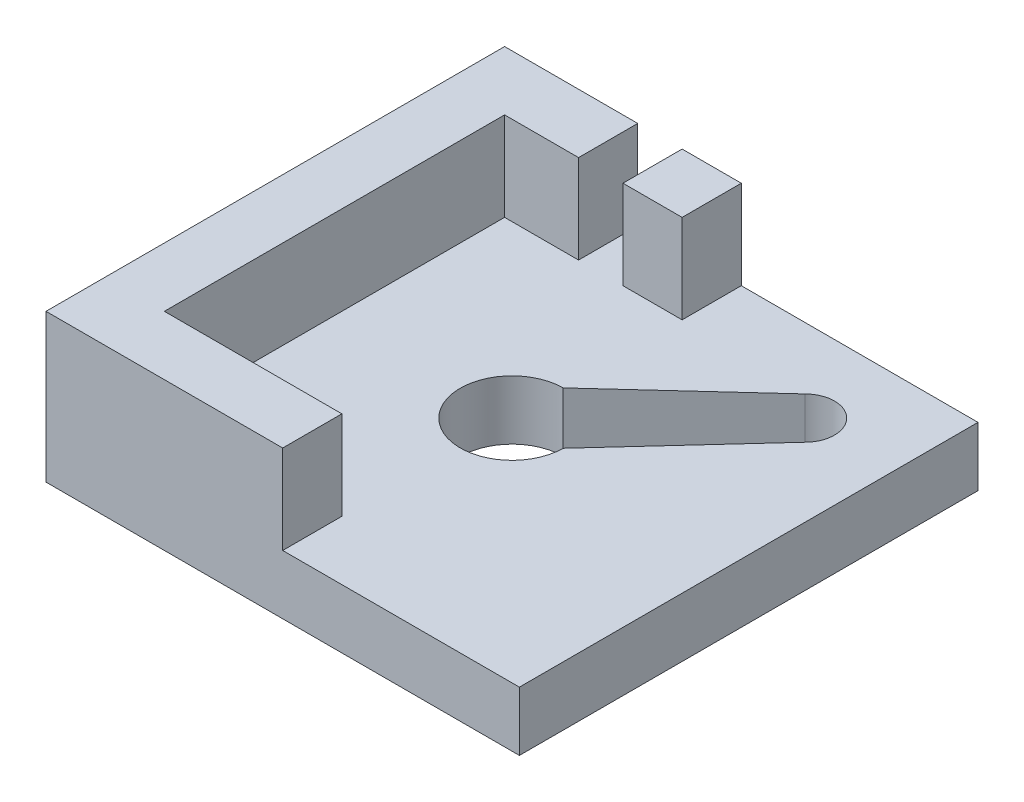
ISO-10303-21;
HEADER;
FILE_DESCRIPTION(('STEP AP214'),'2;1');
FILE_NAME('part.step','',(''),(''),'','','');
FILE_SCHEMA(('AUTOMOTIVE_DESIGN { 1 0 10303 214 1 1 1 1 }'));
ENDSEC;
DATA;
#1=APPLICATION_CONTEXT('core data for automotive mechanical design processes');
#2=APPLICATION_PROTOCOL_DEFINITION('international standard','automotive_design',2000,#1);
#3=PRODUCT_CONTEXT('',#1,'mechanical');
#4=PRODUCT('Part','Part','',(#3));
#5=PRODUCT_RELATED_PRODUCT_CATEGORY('part','',(#4));
#6=PRODUCT_DEFINITION_FORMATION('','',#4);
#7=PRODUCT_DEFINITION_CONTEXT('part definition',#1,'design');
#8=PRODUCT_DEFINITION('design','',#6,#7);
#9=PRODUCT_DEFINITION_SHAPE('','',#8);
#10=(LENGTH_UNIT() NAMED_UNIT(*) SI_UNIT(.MILLI.,.METRE.));
#11=(NAMED_UNIT(*) PLANE_ANGLE_UNIT() SI_UNIT($,.RADIAN.));
#12=(NAMED_UNIT(*) SI_UNIT($,.STERADIAN.) SOLID_ANGLE_UNIT());
#13=UNCERTAINTY_MEASURE_WITH_UNIT(LENGTH_MEASURE(1.E-05),#10,'distance_accuracy_value','');
#14=(GEOMETRIC_REPRESENTATION_CONTEXT(3) GLOBAL_UNCERTAINTY_ASSIGNED_CONTEXT((#13)) GLOBAL_UNIT_ASSIGNED_CONTEXT((#10,
#11,#12)) REPRESENTATION_CONTEXT('',''));
#15=CARTESIAN_POINT('',(0.,0.,0.));
#16=DIRECTION('',(0.,0.,1.));
#17=DIRECTION('',(1.,0.,0.));
#18=AXIS2_PLACEMENT_3D('',#15,#16,#17);
#19=CARTESIAN_POINT('',(0.,4.,0.));
#20=DIRECTION('',(0.,-1.,0.));
#21=DIRECTION('',(0.,0.,-1.));
#22=AXIS2_PLACEMENT_3D('',#19,#20,#21);
#23=PLANE('',#22);
#24=DIRECTION('',(0.,0.,-1.));
#25=VECTOR('',#24,1.);
#26=CARTESIAN_POINT('',(0.,4.,-15.5));
#27=LINE('',#26,#25);
#28=CARTESIAN_POINT('',(0.,4.,-11.5));
#29=VERTEX_POINT('',#28);
#30=CARTESIAN_POINT('',(0.,4.,-15.5));
#31=VERTEX_POINT('',#30);
#32=EDGE_CURVE('E252',#29,#31,#27,.T.);
#33=ORIENTED_EDGE('',*,*,#32,.F.);
#34=DIRECTION('',(1.,0.,0.));
#35=VECTOR('',#34,1.);
#36=CARTESIAN_POINT('',(0.,4.,-11.5));
#37=LINE('',#36,#35);
#38=CARTESIAN_POINT('',(-4.,4.,-11.5));
#39=VERTEX_POINT('',#38);
#40=EDGE_CURVE('E248',#39,#29,#37,.T.);
#41=ORIENTED_EDGE('',*,*,#40,.F.);
#42=DIRECTION('',(0.,0.,-1.));
#43=VECTOR('',#42,1.);
#44=CARTESIAN_POINT('',(-4.,4.,-15.5));
#45=LINE('',#44,#43);
#46=CARTESIAN_POINT('',(-4.,4.,-15.5));
#47=VERTEX_POINT('',#46);
#48=EDGE_CURVE('E198',#39,#47,#45,.T.);
#49=ORIENTED_EDGE('',*,*,#48,.T.);
#50=DIRECTION('',(-1.,0.,0.));
#51=VECTOR('',#50,1.);
#52=CARTESIAN_POINT('',(-7.,4.,-15.5));
#53=LINE('',#52,#51);
#54=CARTESIAN_POINT('',(-7.,4.,-15.5));
#55=VERTEX_POINT('',#54);
#56=EDGE_CURVE('E202',#47,#55,#53,.T.);
#57=ORIENTED_EDGE('',*,*,#56,.T.);
#58=DIRECTION('',(0.,0.,1.));
#59=VECTOR('',#58,1.);
#60=CARTESIAN_POINT('',(-7.,4.,-15.5));
#61=LINE('',#60,#59);
#62=CARTESIAN_POINT('',(-7.,4.,-11.5));
#63=VERTEX_POINT('',#62);
#64=EDGE_CURVE('E195',#55,#63,#61,.T.);
#65=ORIENTED_EDGE('',*,*,#64,.T.);
#66=CARTESIAN_POINT('',(-12.,4.,-11.5));
#67=VERTEX_POINT('',#66);
#68=EDGE_CURVE('E249',#67,#63,#37,.T.);
#69=ORIENTED_EDGE('',*,*,#68,.F.);
#70=DIRECTION('',(0.,0.,-1.));
#71=VECTOR('',#70,1.);
#72=CARTESIAN_POINT('',(-12.,4.,-11.5));
#73=LINE('',#72,#71);
#74=CARTESIAN_POINT('',(-12.,4.,11.5));
#75=VERTEX_POINT('',#74);
#76=EDGE_CURVE('E245',#75,#67,#73,.T.);
#77=ORIENTED_EDGE('',*,*,#76,.F.);
#78=DIRECTION('',(-1.,0.,0.));
#79=VECTOR('',#78,1.);
#80=CARTESIAN_POINT('',(-12.,4.,11.5));
#81=LINE('',#80,#79);
#82=CARTESIAN_POINT('',(0.,4.,11.5));
#83=VERTEX_POINT('',#82);
#84=EDGE_CURVE('E242',#83,#75,#81,.T.);
#85=ORIENTED_EDGE('',*,*,#84,.F.);
#86=DIRECTION('',(0.,0.,-1.));
#87=VECTOR('',#86,1.);
#88=CARTESIAN_POINT('',(0.,4.,15.5));
#89=LINE('',#88,#87);
#90=CARTESIAN_POINT('',(0.,4.,15.5));
#91=VERTEX_POINT('',#90);
#92=EDGE_CURVE('E210',#91,#83,#89,.T.);
#93=ORIENTED_EDGE('',*,*,#92,.F.);
#94=DIRECTION('',(1.,0.,0.));
#95=VECTOR('',#94,1.);
#96=CARTESIAN_POINT('',(-16.,4.,15.5));
#97=LINE('',#96,#95);
#98=CARTESIAN_POINT('',(16.,4.,15.5));
#99=VERTEX_POINT('',#98);
#100=EDGE_CURVE('E279',#91,#99,#97,.T.);
#101=ORIENTED_EDGE('',*,*,#100,.T.);
#102=DIRECTION('',(0.,0.,-1.));
#103=VECTOR('',#102,1.);
#104=CARTESIAN_POINT('',(16.,4.,15.5));
#105=LINE('',#104,#103);
#106=CARTESIAN_POINT('',(16.,4.,-15.5));
#107=VERTEX_POINT('',#106);
#108=EDGE_CURVE('E273',#99,#107,#105,.T.);
#109=ORIENTED_EDGE('',*,*,#108,.T.);
#110=DIRECTION('',(-1.,0.,0.));
#111=VECTOR('',#110,1.);
#112=CARTESIAN_POINT('',(-16.,4.,-15.5));
#113=LINE('',#112,#111);
#114=EDGE_CURVE('E276',#107,#31,#113,.T.);
#115=ORIENTED_EDGE('',*,*,#114,.T.);
#116=EDGE_LOOP('',(#33,#41,#49,#57,#65,#69,#77,#85,#93,#101,#109,#115));
#117=FACE_BOUND('',#116,.T.);
#118=CARTESIAN_POINT('',(9.89949493661086,4.,-9.89949493661249));
#119=DIRECTION('',(0.,1.,0.));
#120=DIRECTION('',(0.,0.,1.));
#121=AXIS2_PLACEMENT_3D('',#118,#119,#120);
#122=CIRCLE('',#121,1.99999999999998);
#123=CARTESIAN_POINT('',(8.48528137423761,4.,-11.3137084989855));
#124=VERTEX_POINT('',#123);
#125=CARTESIAN_POINT('',(11.3137084989841,4.,-8.48528137423954));
#126=VERTEX_POINT('',#125);
#127=EDGE_CURVE('E49',#124,#126,#122,.F.);
#128=ORIENTED_EDGE('',*,*,#127,.T.);
#129=DIRECTION('',(0.675864508150476,0.,-0.737025892776173));
#130=VECTOR('',#129,1.);
#131=CARTESIAN_POINT('',(1.91891736013424,4.,1.75967784917755));
#132=LINE('',#131,#130);
#133=CARTESIAN_POINT('',(3.49981776053525,4.,0.0357161453971998));
#134=VERTEX_POINT('',#133);
#135=EDGE_CURVE('E176',#134,#126,#132,.T.);
#136=ORIENTED_EDGE('',*,*,#135,.F.);
#137=CARTESIAN_POINT('',(0.,4.,0.));
#138=DIRECTION('',(0.,1.,0.));
#139=DIRECTION('',(0.,0.,1.));
#140=AXIS2_PLACEMENT_3D('',#137,#138,#139);
#141=CIRCLE('',#140,3.5);
#142=CARTESIAN_POINT('',(-0.0357161453977829,4.,-3.49981776053524));
#143=VERTEX_POINT('',#142);
#144=EDGE_CURVE('E179',#143,#134,#141,.T.);
#145=ORIENTED_EDGE('',*,*,#144,.F.);
#146=DIRECTION('',(0.73702589277606,0.,-0.675864508150599));
#147=VECTOR('',#146,1.);
#148=CARTESIAN_POINT('',(-1.75967784917787,4.,-1.91891736013395));
#149=LINE('',#148,#147);
#150=EDGE_CURVE('E185',#143,#124,#149,.T.);
#151=ORIENTED_EDGE('',*,*,#150,.T.);
#152=EDGE_LOOP('',(#128,#136,#145,#151));
#153=FACE_BOUND('',#152,.T.);
#154=ADVANCED_FACE('F34',(#117,#153),#23,.F.);
#155=CARTESIAN_POINT('',(0.,0.,0.));
#156=DIRECTION('',(0.,-1.,0.));
#157=DIRECTION('',(0.,0.,-1.));
#158=AXIS2_PLACEMENT_3D('',#155,#156,#157);
#159=PLANE('',#158);
#160=DIRECTION('',(0.,0.,-1.));
#161=VECTOR('',#160,1.);
#162=CARTESIAN_POINT('',(16.,0.,15.5));
#163=LINE('',#162,#161);
#164=CARTESIAN_POINT('',(16.,0.,15.5));
#165=VERTEX_POINT('',#164);
#166=CARTESIAN_POINT('',(16.,0.,-15.5));
#167=VERTEX_POINT('',#166);
#168=EDGE_CURVE('E272',#165,#167,#163,.T.);
#169=ORIENTED_EDGE('',*,*,#168,.F.);
#170=DIRECTION('',(1.,0.,0.));
#171=VECTOR('',#170,1.);
#172=CARTESIAN_POINT('',(-16.,0.,15.5));
#173=LINE('',#172,#171);
#174=CARTESIAN_POINT('',(-16.,0.,15.5));
#175=VERTEX_POINT('',#174);
#176=EDGE_CURVE('E277',#175,#165,#173,.T.);
#177=ORIENTED_EDGE('',*,*,#176,.F.);
#178=DIRECTION('',(0.,0.,1.));
#179=VECTOR('',#178,1.);
#180=CARTESIAN_POINT('',(-16.,0.,15.5));
#181=LINE('',#180,#179);
#182=CARTESIAN_POINT('',(-16.,0.,-15.5));
#183=VERTEX_POINT('',#182);
#184=EDGE_CURVE('E286',#183,#175,#181,.T.);
#185=ORIENTED_EDGE('',*,*,#184,.F.);
#186=DIRECTION('',(-1.,0.,0.));
#187=VECTOR('',#186,1.);
#188=CARTESIAN_POINT('',(-16.,0.,-15.5));
#189=LINE('',#188,#187);
#190=EDGE_CURVE('E284',#167,#183,#189,.T.);
#191=ORIENTED_EDGE('',*,*,#190,.F.);
#192=EDGE_LOOP('',(#169,#177,#185,#191));
#193=FACE_BOUND('',#192,.T.);
#194=DIRECTION('',(0.675864508150476,0.,-0.737025892776173));
#195=VECTOR('',#194,1.);
#196=CARTESIAN_POINT('',(1.91891736013424,0.,1.75967784917755));
#197=LINE('',#196,#195);
#198=CARTESIAN_POINT('',(3.49981776053525,0.,0.0357161453971998));
#199=VERTEX_POINT('',#198);
#200=CARTESIAN_POINT('',(11.3137084989841,0.,-8.48528137423954));
#201=VERTEX_POINT('',#200);
#202=EDGE_CURVE('E171',#199,#201,#197,.T.);
#203=ORIENTED_EDGE('',*,*,#202,.T.);
#204=CARTESIAN_POINT('',(9.89949493661086,0.,-9.89949493661249));
#205=DIRECTION('',(0.,1.,0.));
#206=DIRECTION('',(0.,0.,1.));
#207=AXIS2_PLACEMENT_3D('',#204,#205,#206);
#208=CIRCLE('',#207,1.99999999999998);
#209=CARTESIAN_POINT('',(8.48528137423761,0.,-11.3137084989855));
#210=VERTEX_POINT('',#209);
#211=EDGE_CURVE('E167',#210,#201,#208,.F.);
#212=ORIENTED_EDGE('',*,*,#211,.F.);
#213=DIRECTION('',(0.73702589277606,0.,-0.675864508150599));
#214=VECTOR('',#213,1.);
#215=CARTESIAN_POINT('',(-1.75967784917787,0.,-1.91891736013395));
#216=LINE('',#215,#214);
#217=CARTESIAN_POINT('',(-0.0357161453977831,0.,-3.49981776053524));
#218=VERTEX_POINT('',#217);
#219=EDGE_CURVE('E159',#218,#210,#216,.T.);
#220=ORIENTED_EDGE('',*,*,#219,.F.);
#221=CARTESIAN_POINT('',(0.,0.,0.));
#222=DIRECTION('',(0.,1.,0.));
#223=DIRECTION('',(0.,0.,1.));
#224=AXIS2_PLACEMENT_3D('',#221,#222,#223);
#225=CIRCLE('',#224,3.5);
#226=EDGE_CURVE('E57',#218,#199,#225,.T.);
#227=ORIENTED_EDGE('',*,*,#226,.T.);
#228=EDGE_LOOP('',(#203,#212,#220,#227));
#229=FACE_BOUND('',#228,.T.);
#230=ADVANCED_FACE('F174',(#193,#229),#159,.T.);
#231=CARTESIAN_POINT('',(0.,10.,-11.5));
#232=DIRECTION('',(0.,0.,-1.));
#233=DIRECTION('',(-1.,0.,0.));
#234=AXIS2_PLACEMENT_3D('',#231,#232,#233);
#235=PLANE('',#234);
#236=ORIENTED_EDGE('',*,*,#68,.T.);
#237=DIRECTION('',(0.,1.,0.));
#238=VECTOR('',#237,1.);
#239=CARTESIAN_POINT('',(-7.,4.,-11.5));
#240=LINE('',#239,#238);
#241=CARTESIAN_POINT('',(-7.,10.,-11.5));
#242=VERTEX_POINT('',#241);
#243=EDGE_CURVE('E205',#63,#242,#240,.T.);
#244=ORIENTED_EDGE('',*,*,#243,.T.);
#245=DIRECTION('',(1.,0.,0.));
#246=VECTOR('',#245,1.);
#247=CARTESIAN_POINT('',(0.,10.,-11.5));
#248=LINE('',#247,#246);
#249=CARTESIAN_POINT('',(-12.,10.,-11.5));
#250=VERTEX_POINT('',#249);
#251=EDGE_CURVE('E234',#250,#242,#248,.T.);
#252=ORIENTED_EDGE('',*,*,#251,.F.);
#253=DIRECTION('',(0.,-1.,0.));
#254=VECTOR('',#253,1.);
#255=CARTESIAN_POINT('',(-12.,10.,-11.5));
#256=LINE('',#255,#254);
#257=EDGE_CURVE('E260',#250,#67,#256,.T.);
#258=ORIENTED_EDGE('',*,*,#257,.T.);
#259=EDGE_LOOP('',(#236,#244,#252,#258));
#260=FACE_BOUND('',#259,.T.);
#261=ADVANCED_FACE('F355',(#260),#235,.F.);
#262=CARTESIAN_POINT('',(0.,10.,0.));
#263=DIRECTION('',(0.,-1.,0.));
#264=DIRECTION('',(0.,0.,-1.));
#265=AXIS2_PLACEMENT_3D('',#262,#263,#264);
#266=PLANE('',#265);
#267=ORIENTED_EDGE('',*,*,#251,.T.);
#268=DIRECTION('',(0.,0.,1.));
#269=VECTOR('',#268,1.);
#270=CARTESIAN_POINT('',(-7.,10.,-15.5));
#271=LINE('',#270,#269);
#272=CARTESIAN_POINT('',(-7.,10.,-15.5));
#273=VERTEX_POINT('',#272);
#274=EDGE_CURVE('E191',#273,#242,#271,.T.);
#275=ORIENTED_EDGE('',*,*,#274,.F.);
#276=DIRECTION('',(-1.,0.,0.));
#277=VECTOR('',#276,1.);
#278=CARTESIAN_POINT('',(-16.,10.,-15.5));
#279=LINE('',#278,#277);
#280=CARTESIAN_POINT('',(-16.,10.,-15.5));
#281=VERTEX_POINT('',#280);
#282=EDGE_CURVE('E222',#273,#281,#279,.T.);
#283=ORIENTED_EDGE('',*,*,#282,.T.);
#284=DIRECTION('',(0.,0.,1.));
#285=VECTOR('',#284,1.);
#286=CARTESIAN_POINT('',(-16.,10.,-15.5));
#287=LINE('',#286,#285);
#288=CARTESIAN_POINT('',(-16.,10.,15.5));
#289=VERTEX_POINT('',#288);
#290=EDGE_CURVE('E221',#281,#289,#287,.T.);
#291=ORIENTED_EDGE('',*,*,#290,.T.);
#292=DIRECTION('',(1.,0.,0.));
#293=VECTOR('',#292,1.);
#294=CARTESIAN_POINT('',(-16.,10.,15.5));
#295=LINE('',#294,#293);
#296=CARTESIAN_POINT('',(0.,10.,15.5));
#297=VERTEX_POINT('',#296);
#298=EDGE_CURVE('E225',#289,#297,#295,.T.);
#299=ORIENTED_EDGE('',*,*,#298,.T.);
#300=DIRECTION('',(0.,0.,-1.));
#301=VECTOR('',#300,1.);
#302=CARTESIAN_POINT('',(0.,10.,15.5));
#303=LINE('',#302,#301);
#304=CARTESIAN_POINT('',(0.,10.,11.5));
#305=VERTEX_POINT('',#304);
#306=EDGE_CURVE('E227',#297,#305,#303,.T.);
#307=ORIENTED_EDGE('',*,*,#306,.T.);
#308=DIRECTION('',(-1.,0.,0.));
#309=VECTOR('',#308,1.);
#310=CARTESIAN_POINT('',(-12.,10.,11.5));
#311=LINE('',#310,#309);
#312=CARTESIAN_POINT('',(-12.,10.,11.5));
#313=VERTEX_POINT('',#312);
#314=EDGE_CURVE('E229',#305,#313,#311,.T.);
#315=ORIENTED_EDGE('',*,*,#314,.T.);
#316=DIRECTION('',(0.,0.,-1.));
#317=VECTOR('',#316,1.);
#318=CARTESIAN_POINT('',(-12.,10.,-11.5));
#319=LINE('',#318,#317);
#320=EDGE_CURVE('E231',#313,#250,#319,.T.);
#321=ORIENTED_EDGE('',*,*,#320,.T.);
#322=EDGE_LOOP('',(#267,#275,#283,#291,#299,#307,#315,#321));
#323=FACE_BOUND('',#322,.T.);
#324=ADVANCED_FACE('F322',(#323),#266,.F.);
#325=CARTESIAN_POINT('',(16.,4.,15.5));
#326=DIRECTION('',(-1.,0.,0.));
#327=DIRECTION('',(0.,0.,1.));
#328=AXIS2_PLACEMENT_3D('',#325,#326,#327);
#329=PLANE('',#328);
#330=ORIENTED_EDGE('',*,*,#168,.T.);
#331=DIRECTION('',(0.,-1.,0.));
#332=VECTOR('',#331,1.);
#333=CARTESIAN_POINT('',(16.,4.,-15.5));
#334=LINE('',#333,#332);
#335=EDGE_CURVE('E11',#107,#167,#334,.T.);
#336=ORIENTED_EDGE('',*,*,#335,.F.);
#337=ORIENTED_EDGE('',*,*,#108,.F.);
#338=DIRECTION('',(0.,-1.,0.));
#339=VECTOR('',#338,1.);
#340=CARTESIAN_POINT('',(16.,4.,15.5));
#341=LINE('',#340,#339);
#342=EDGE_CURVE('E281',#99,#165,#341,.T.);
#343=ORIENTED_EDGE('',*,*,#342,.T.);
#344=EDGE_LOOP('',(#330,#336,#337,#343));
#345=FACE_BOUND('',#344,.T.);
#346=ADVANCED_FACE('F36',(#345),#329,.F.);
#347=CARTESIAN_POINT('',(-16.,4.,-15.5));
#348=DIRECTION('',(0.,0.,1.));
#349=DIRECTION('',(1.,0.,0.));
#350=AXIS2_PLACEMENT_3D('',#347,#348,#349);
#351=PLANE('',#350);
#352=ORIENTED_EDGE('',*,*,#282,.F.);
#353=DIRECTION('',(0.,1.,0.));
#354=VECTOR('',#353,1.);
#355=CARTESIAN_POINT('',(-7.,4.,-15.5));
#356=LINE('',#355,#354);
#357=EDGE_CURVE('E208',#55,#273,#356,.T.);
#358=ORIENTED_EDGE('',*,*,#357,.F.);
#359=ORIENTED_EDGE('',*,*,#56,.F.);
#360=DIRECTION('',(0.,1.,0.));
#361=VECTOR('',#360,1.);
#362=CARTESIAN_POINT('',(-4.,4.,-15.5));
#363=LINE('',#362,#361);
#364=CARTESIAN_POINT('',(-4.,10.,-15.5));
#365=VERTEX_POINT('',#364);
#366=EDGE_CURVE('E211',#47,#365,#363,.T.);
#367=ORIENTED_EDGE('',*,*,#366,.T.);
#368=CARTESIAN_POINT('',(0.,10.,-15.5));
#369=VERTEX_POINT('',#368);
#370=EDGE_CURVE('E218',#369,#365,#279,.T.);
#371=ORIENTED_EDGE('',*,*,#370,.F.);
#372=DIRECTION('',(0.,-1.,0.));
#373=VECTOR('',#372,1.);
#374=CARTESIAN_POINT('',(0.,10.,-15.5));
#375=LINE('',#374,#373);
#376=EDGE_CURVE('E239',#369,#31,#375,.T.);
#377=ORIENTED_EDGE('',*,*,#376,.T.);
#378=ORIENTED_EDGE('',*,*,#114,.F.);
#379=ORIENTED_EDGE('',*,*,#335,.T.);
#380=ORIENTED_EDGE('',*,*,#190,.T.);
#381=DIRECTION('',(0.,-1.,0.));
#382=VECTOR('',#381,1.);
#383=CARTESIAN_POINT('',(-16.,4.,-15.5));
#384=LINE('',#383,#382);
#385=EDGE_CURVE('E42',#281,#183,#384,.T.);
#386=ORIENTED_EDGE('',*,*,#385,.F.);
#387=EDGE_LOOP('',(#352,#358,#359,#367,#371,#377,#378,#379,#380,#386));
#388=FACE_BOUND('',#387,.T.);
#389=ADVANCED_FACE('F326',(#388),#351,.F.);
#390=CARTESIAN_POINT('',(-16.,4.,15.5));
#391=DIRECTION('',(1.,0.,0.));
#392=DIRECTION('',(0.,0.,-1.));
#393=AXIS2_PLACEMENT_3D('',#390,#391,#392);
#394=PLANE('',#393);
#395=ORIENTED_EDGE('',*,*,#184,.T.);
#396=DIRECTION('',(0.,-1.,0.));
#397=VECTOR('',#396,1.);
#398=CARTESIAN_POINT('',(-16.,4.,15.5));
#399=LINE('',#398,#397);
#400=EDGE_CURVE('E291',#289,#175,#399,.T.);
#401=ORIENTED_EDGE('',*,*,#400,.F.);
#402=ORIENTED_EDGE('',*,*,#290,.F.);
#403=ORIENTED_EDGE('',*,*,#385,.T.);
#404=EDGE_LOOP('',(#395,#401,#402,#403));
#405=FACE_BOUND('',#404,.T.);
#406=ADVANCED_FACE('F298',(#405),#394,.F.);
#407=CARTESIAN_POINT('',(-16.,4.,15.5));
#408=DIRECTION('',(0.,0.,-1.));
#409=DIRECTION('',(-1.,0.,0.));
#410=AXIS2_PLACEMENT_3D('',#407,#408,#409);
#411=PLANE('',#410);
#412=ORIENTED_EDGE('',*,*,#176,.T.);
#413=ORIENTED_EDGE('',*,*,#342,.F.);
#414=ORIENTED_EDGE('',*,*,#100,.F.);
#415=DIRECTION('',(0.,-1.,0.));
#416=VECTOR('',#415,1.);
#417=CARTESIAN_POINT('',(0.,10.,15.5));
#418=LINE('',#417,#416);
#419=EDGE_CURVE('E269',#297,#91,#418,.T.);
#420=ORIENTED_EDGE('',*,*,#419,.F.);
#421=ORIENTED_EDGE('',*,*,#298,.F.);
#422=ORIENTED_EDGE('',*,*,#400,.T.);
#423=EDGE_LOOP('',(#412,#413,#414,#420,#421,#422));
#424=FACE_BOUND('',#423,.T.);
#425=ADVANCED_FACE('F306',(#424),#411,.F.);
#426=CARTESIAN_POINT('',(0.,10.,15.5));
#427=DIRECTION('',(-1.,0.,0.));
#428=DIRECTION('',(0.,0.,1.));
#429=AXIS2_PLACEMENT_3D('',#426,#427,#428);
#430=PLANE('',#429);
#431=ORIENTED_EDGE('',*,*,#92,.T.);
#432=DIRECTION('',(0.,-1.,0.));
#433=VECTOR('',#432,1.);
#434=CARTESIAN_POINT('',(0.,10.,11.5));
#435=LINE('',#434,#433);
#436=EDGE_CURVE('E266',#305,#83,#435,.T.);
#437=ORIENTED_EDGE('',*,*,#436,.F.);
#438=ORIENTED_EDGE('',*,*,#306,.F.);
#439=ORIENTED_EDGE('',*,*,#419,.T.);
#440=EDGE_LOOP('',(#431,#437,#438,#439));
#441=FACE_BOUND('',#440,.T.);
#442=ADVANCED_FACE('F318',(#441),#430,.F.);
#443=CARTESIAN_POINT('',(-12.,10.,11.5));
#444=DIRECTION('',(0.,0.,1.));
#445=DIRECTION('',(1.,0.,0.));
#446=AXIS2_PLACEMENT_3D('',#443,#444,#445);
#447=PLANE('',#446);
#448=ORIENTED_EDGE('',*,*,#84,.T.);
#449=DIRECTION('',(0.,-1.,0.));
#450=VECTOR('',#449,1.);
#451=CARTESIAN_POINT('',(-12.,10.,11.5));
#452=LINE('',#451,#450);
#453=EDGE_CURVE('E263',#313,#75,#452,.T.);
#454=ORIENTED_EDGE('',*,*,#453,.F.);
#455=ORIENTED_EDGE('',*,*,#314,.F.);
#456=ORIENTED_EDGE('',*,*,#436,.T.);
#457=EDGE_LOOP('',(#448,#454,#455,#456));
#458=FACE_BOUND('',#457,.T.);
#459=ADVANCED_FACE('F478',(#458),#447,.F.);
#460=CARTESIAN_POINT('',(-12.,10.,-11.5));
#461=DIRECTION('',(-1.,0.,0.));
#462=DIRECTION('',(0.,0.,1.));
#463=AXIS2_PLACEMENT_3D('',#460,#461,#462);
#464=PLANE('',#463);
#465=ORIENTED_EDGE('',*,*,#76,.T.);
#466=ORIENTED_EDGE('',*,*,#257,.F.);
#467=ORIENTED_EDGE('',*,*,#320,.F.);
#468=ORIENTED_EDGE('',*,*,#453,.T.);
#469=EDGE_LOOP('',(#465,#466,#467,#468));
#470=FACE_BOUND('',#469,.T.);
#471=ADVANCED_FACE('F353',(#470),#464,.F.);
#472=CARTESIAN_POINT('',(-4.,10.,-11.5));
#473=VERTEX_POINT('',#472);
#474=CARTESIAN_POINT('',(0.,10.,-11.5));
#475=VERTEX_POINT('',#474);
#476=EDGE_CURVE('E233',#473,#475,#248,.T.);
#477=ORIENTED_EDGE('',*,*,#476,.F.);
#478=DIRECTION('',(0.,1.,0.));
#479=VECTOR('',#478,1.);
#480=CARTESIAN_POINT('',(-4.,4.,-11.5));
#481=LINE('',#480,#479);
#482=EDGE_CURVE('E214',#39,#473,#481,.T.);
#483=ORIENTED_EDGE('',*,*,#482,.F.);
#484=ORIENTED_EDGE('',*,*,#40,.T.);
#485=DIRECTION('',(0.,-1.,0.));
#486=VECTOR('',#485,1.);
#487=CARTESIAN_POINT('',(0.,10.,-11.5));
#488=LINE('',#487,#486);
#489=EDGE_CURVE('E257',#475,#29,#488,.T.);
#490=ORIENTED_EDGE('',*,*,#489,.F.);
#491=EDGE_LOOP('',(#477,#483,#484,#490));
#492=FACE_BOUND('',#491,.T.);
#493=ADVANCED_FACE('F337',(#492),#235,.F.);
#494=CARTESIAN_POINT('',(0.,10.,-15.5));
#495=DIRECTION('',(-1.,0.,0.));
#496=DIRECTION('',(0.,0.,1.));
#497=AXIS2_PLACEMENT_3D('',#494,#495,#496);
#498=PLANE('',#497);
#499=ORIENTED_EDGE('',*,*,#32,.T.);
#500=ORIENTED_EDGE('',*,*,#376,.F.);
#501=DIRECTION('',(0.,0.,-1.));
#502=VECTOR('',#501,1.);
#503=CARTESIAN_POINT('',(0.,10.,-15.5));
#504=LINE('',#503,#502);
#505=EDGE_CURVE('E237',#475,#369,#504,.T.);
#506=ORIENTED_EDGE('',*,*,#505,.F.);
#507=ORIENTED_EDGE('',*,*,#489,.T.);
#508=EDGE_LOOP('',(#499,#500,#506,#507));
#509=FACE_BOUND('',#508,.T.);
#510=ADVANCED_FACE('F345',(#509),#498,.F.);
#511=ORIENTED_EDGE('',*,*,#370,.T.);
#512=DIRECTION('',(0.,0.,-1.));
#513=VECTOR('',#512,1.);
#514=CARTESIAN_POINT('',(-4.,10.,-15.5));
#515=LINE('',#514,#513);
#516=EDGE_CURVE('E199',#473,#365,#515,.T.);
#517=ORIENTED_EDGE('',*,*,#516,.F.);
#518=ORIENTED_EDGE('',*,*,#476,.T.);
#519=ORIENTED_EDGE('',*,*,#505,.T.);
#520=EDGE_LOOP('',(#511,#517,#518,#519));
#521=FACE_BOUND('',#520,.T.);
#522=ADVANCED_FACE('F341',(#521),#266,.F.);
#523=CARTESIAN_POINT('',(-7.,4.,-15.5));
#524=DIRECTION('',(-1.,0.,0.));
#525=DIRECTION('',(0.,0.,1.));
#526=AXIS2_PLACEMENT_3D('',#523,#524,#525);
#527=PLANE('',#526);
#528=ORIENTED_EDGE('',*,*,#274,.T.);
#529=ORIENTED_EDGE('',*,*,#243,.F.);
#530=ORIENTED_EDGE('',*,*,#64,.F.);
#531=ORIENTED_EDGE('',*,*,#357,.T.);
#532=EDGE_LOOP('',(#528,#529,#530,#531));
#533=FACE_BOUND('',#532,.T.);
#534=ADVANCED_FACE('F329',(#533),#527,.F.);
#535=CARTESIAN_POINT('',(-4.,4.,-15.5));
#536=DIRECTION('',(1.,0.,0.));
#537=DIRECTION('',(0.,0.,-1.));
#538=AXIS2_PLACEMENT_3D('',#535,#536,#537);
#539=PLANE('',#538);
#540=ORIENTED_EDGE('',*,*,#516,.T.);
#541=ORIENTED_EDGE('',*,*,#366,.F.);
#542=ORIENTED_EDGE('',*,*,#48,.F.);
#543=ORIENTED_EDGE('',*,*,#482,.T.);
#544=EDGE_LOOP('',(#540,#541,#542,#543));
#545=FACE_BOUND('',#544,.T.);
#546=ADVANCED_FACE('F333',(#545),#539,.F.);
#547=CARTESIAN_POINT('',(9.89949493661086,0.,-9.89949493661249));
#548=DIRECTION('',(0.,1.,0.));
#549=DIRECTION('',(0.,0.,1.));
#550=AXIS2_PLACEMENT_3D('',#547,#548,#549);
#551=CYLINDRICAL_SURFACE('',#550,1.99999999999998);
#552=ORIENTED_EDGE('',*,*,#127,.F.);
#553=DIRECTION('',(0.,1.,0.));
#554=VECTOR('',#553,1.);
#555=CARTESIAN_POINT('',(8.48528137423761,0.,-11.3137084989855));
#556=LINE('',#555,#554);
#557=EDGE_CURVE('E162',#210,#124,#556,.T.);
#558=ORIENTED_EDGE('',*,*,#557,.F.);
#559=ORIENTED_EDGE('',*,*,#211,.T.);
#560=DIRECTION('',(0.,1.,0.));
#561=VECTOR('',#560,1.);
#562=CARTESIAN_POINT('',(11.3137084989841,0.,-8.48528137423954));
#563=LINE('',#562,#561);
#564=EDGE_CURVE('E189',#201,#126,#563,.T.);
#565=ORIENTED_EDGE('',*,*,#564,.T.);
#566=EDGE_LOOP('',(#552,#558,#559,#565));
#567=FACE_BOUND('',#566,.T.);
#568=ADVANCED_FACE('F169',(#567),#551,.F.);
#569=CARTESIAN_POINT('',(1.91891736013424,0.,1.75967784917755));
#570=DIRECTION('',(0.737025892776173,0.,0.675864508150476));
#571=DIRECTION('',(0.675864508150476,0.,-0.737025892776173));
#572=AXIS2_PLACEMENT_3D('',#569,#570,#571);
#573=PLANE('',#572);
#574=ORIENTED_EDGE('',*,*,#135,.T.);
#575=ORIENTED_EDGE('',*,*,#564,.F.);
#576=ORIENTED_EDGE('',*,*,#202,.F.);
#577=DIRECTION('',(0.,1.,0.));
#578=VECTOR('',#577,1.);
#579=CARTESIAN_POINT('',(3.49981776053525,0.,0.0357161453971998));
#580=LINE('',#579,#578);
#581=EDGE_CURVE('E192',#199,#134,#580,.T.);
#582=ORIENTED_EDGE('',*,*,#581,.T.);
#583=EDGE_LOOP('',(#574,#575,#576,#582));
#584=FACE_BOUND('',#583,.T.);
#585=ADVANCED_FACE('F387',(#584),#573,.F.);
#586=CARTESIAN_POINT('',(0.,0.,0.));
#587=DIRECTION('',(0.,1.,0.));
#588=DIRECTION('',(0.,0.,1.));
#589=AXIS2_PLACEMENT_3D('',#586,#587,#588);
#590=CYLINDRICAL_SURFACE('',#589,3.5);
#591=ORIENTED_EDGE('',*,*,#144,.T.);
#592=ORIENTED_EDGE('',*,*,#581,.F.);
#593=ORIENTED_EDGE('',*,*,#226,.F.);
#594=DIRECTION('',(0.,1.,0.));
#595=VECTOR('',#594,1.);
#596=CARTESIAN_POINT('',(-0.0357161453977829,0.,-3.49981776053524));
#597=LINE('',#596,#595);
#598=EDGE_CURVE('E164',#218,#143,#597,.T.);
#599=ORIENTED_EDGE('',*,*,#598,.T.);
#600=EDGE_LOOP('',(#591,#592,#593,#599));
#601=FACE_BOUND('',#600,.T.);
#602=ADVANCED_FACE('F390',(#601),#590,.F.);
#603=CARTESIAN_POINT('',(-1.75967784917787,0.,-1.91891736013395));
#604=DIRECTION('',(0.6758645081506,0.,0.73702589277606));
#605=DIRECTION('',(0.73702589277606,0.,-0.6758645081506));
#606=AXIS2_PLACEMENT_3D('',#603,#604,#605);
#607=PLANE('',#606);
#608=ORIENTED_EDGE('',*,*,#150,.F.);
#609=ORIENTED_EDGE('',*,*,#598,.F.);
#610=ORIENTED_EDGE('',*,*,#219,.T.);
#611=ORIENTED_EDGE('',*,*,#557,.T.);
#612=EDGE_LOOP('',(#608,#609,#610,#611));
#613=FACE_BOUND('',#612,.T.);
#614=ADVANCED_FACE('F161',(#613),#607,.T.);
#615=CLOSED_SHELL('',(#154,#230,#261,#324,#346,#389,#406,#425,#442,#459,#471,#493,#510,#522,
#534,#546,#568,#585,#602,#614));
#616=MANIFOLD_SOLID_BREP('B2',#615);
#617=ADVANCED_BREP_SHAPE_REPRESENTATION('',(#18,#616),#14);
#618=SHAPE_DEFINITION_REPRESENTATION(#9,#617);
ENDSEC;
END-ISO-10303-21;
